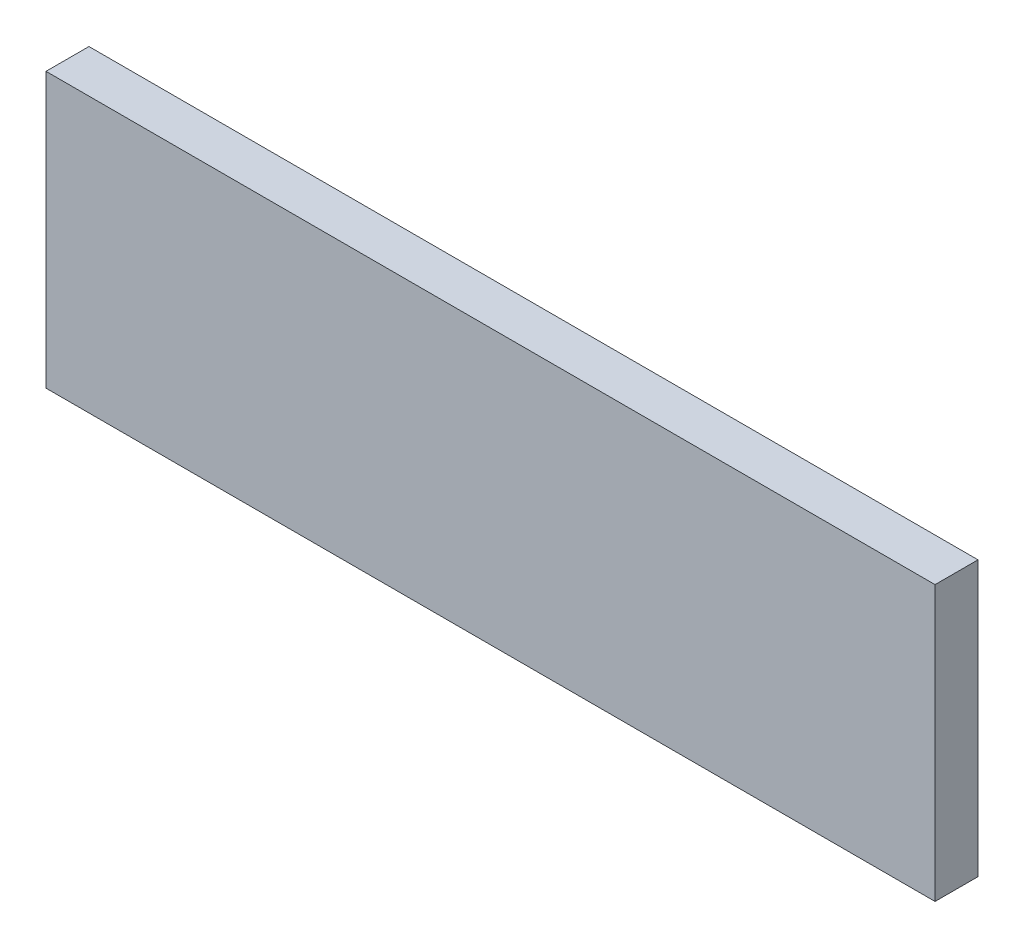
ISO-10303-21;
HEADER;
FILE_DESCRIPTION(('STEP AP214'),'2;1');
FILE_NAME('part.step','',(''),(''),'','','');
FILE_SCHEMA(('AUTOMOTIVE_DESIGN { 1 0 10303 214 1 1 1 1 }'));
ENDSEC;
DATA;
#1=APPLICATION_CONTEXT('core data for automotive mechanical design processes');
#2=APPLICATION_PROTOCOL_DEFINITION('international standard','automotive_design',2000,#1);
#3=PRODUCT_CONTEXT('',#1,'mechanical');
#4=PRODUCT('Part','Part','',(#3));
#5=PRODUCT_RELATED_PRODUCT_CATEGORY('part','',(#4));
#6=PRODUCT_DEFINITION_FORMATION('','',#4);
#7=PRODUCT_DEFINITION_CONTEXT('part definition',#1,'design');
#8=PRODUCT_DEFINITION('design','',#6,#7);
#9=PRODUCT_DEFINITION_SHAPE('','',#8);
#10=(LENGTH_UNIT() NAMED_UNIT(*) SI_UNIT(.MILLI.,.METRE.));
#11=(NAMED_UNIT(*) PLANE_ANGLE_UNIT() SI_UNIT($,.RADIAN.));
#12=(NAMED_UNIT(*) SI_UNIT($,.STERADIAN.) SOLID_ANGLE_UNIT());
#13=UNCERTAINTY_MEASURE_WITH_UNIT(LENGTH_MEASURE(1.E-05),#10,'distance_accuracy_value','');
#14=(GEOMETRIC_REPRESENTATION_CONTEXT(3) GLOBAL_UNCERTAINTY_ASSIGNED_CONTEXT((#13)) GLOBAL_UNIT_ASSIGNED_CONTEXT((#10,
#11,#12)) REPRESENTATION_CONTEXT('',''));
#15=CARTESIAN_POINT('',(0.,0.,0.));
#16=DIRECTION('',(0.,0.,1.));
#17=DIRECTION('',(1.,0.,0.));
#18=AXIS2_PLACEMENT_3D('',#15,#16,#17);
#19=CARTESIAN_POINT('',(287.58,-57.5,18.));
#20=DIRECTION('',(-1.,0.,0.));
#21=DIRECTION('',(0.,0.,1.));
#22=AXIS2_PLACEMENT_3D('',#19,#20,#21);
#23=PLANE('',#22);
#24=DIRECTION('',(0.,1.,0.));
#25=VECTOR('',#24,1.);
#26=CARTESIAN_POINT('',(287.58,-57.5,0.));
#27=LINE('',#26,#25);
#28=CARTESIAN_POINT('',(287.58,-57.5,0.));
#29=VERTEX_POINT('',#28);
#30=CARTESIAN_POINT('',(287.58,57.5,0.));
#31=VERTEX_POINT('',#30);
#32=EDGE_CURVE('E107',#29,#31,#27,.T.);
#33=ORIENTED_EDGE('',*,*,#32,.T.);
#34=DIRECTION('',(0.,0.,-1.));
#35=VECTOR('',#34,1.);
#36=CARTESIAN_POINT('',(287.58,57.5,18.));
#37=LINE('',#36,#35);
#38=CARTESIAN_POINT('',(287.58,57.5,18.));
#39=VERTEX_POINT('',#38);
#40=EDGE_CURVE('E11',#39,#31,#37,.T.);
#41=ORIENTED_EDGE('',*,*,#40,.F.);
#42=DIRECTION('',(0.,1.,0.));
#43=VECTOR('',#42,1.);
#44=CARTESIAN_POINT('',(287.58,-57.5,18.));
#45=LINE('',#44,#43);
#46=CARTESIAN_POINT('',(287.58,-57.5,18.));
#47=VERTEX_POINT('',#46);
#48=EDGE_CURVE('E91',#47,#39,#45,.T.);
#49=ORIENTED_EDGE('',*,*,#48,.F.);
#50=DIRECTION('',(0.,0.,-1.));
#51=VECTOR('',#50,1.);
#52=CARTESIAN_POINT('',(287.58,-57.5,18.));
#53=LINE('',#52,#51);
#54=EDGE_CURVE('E103',#47,#29,#53,.T.);
#55=ORIENTED_EDGE('',*,*,#54,.T.);
#56=EDGE_LOOP('',(#33,#41,#49,#55));
#57=FACE_BOUND('',#56,.T.);
#58=ADVANCED_FACE('F39',(#57),#23,.F.);
#59=CARTESIAN_POINT('',(-85.,57.5,18.));
#60=DIRECTION('',(0.,-1.,0.));
#61=DIRECTION('',(0.,0.,-1.));
#62=AXIS2_PLACEMENT_3D('',#59,#60,#61);
#63=PLANE('',#62);
#64=DIRECTION('',(-1.,0.,0.));
#65=VECTOR('',#64,1.);
#66=CARTESIAN_POINT('',(-85.,57.5,0.));
#67=LINE('',#66,#65);
#68=CARTESIAN_POINT('',(-85.,57.5,0.));
#69=VERTEX_POINT('',#68);
#70=EDGE_CURVE('E96',#31,#69,#67,.T.);
#71=ORIENTED_EDGE('',*,*,#70,.T.);
#72=DIRECTION('',(0.,0.,-1.));
#73=VECTOR('',#72,1.);
#74=CARTESIAN_POINT('',(-85.,57.5,18.));
#75=LINE('',#74,#73);
#76=CARTESIAN_POINT('',(-85.,57.5,18.));
#77=VERTEX_POINT('',#76);
#78=EDGE_CURVE('E48',#77,#69,#75,.T.);
#79=ORIENTED_EDGE('',*,*,#78,.F.);
#80=DIRECTION('',(-1.,0.,0.));
#81=VECTOR('',#80,1.);
#82=CARTESIAN_POINT('',(-85.,57.5,18.));
#83=LINE('',#82,#81);
#84=EDGE_CURVE('E86',#39,#77,#83,.T.);
#85=ORIENTED_EDGE('',*,*,#84,.F.);
#86=ORIENTED_EDGE('',*,*,#40,.T.);
#87=EDGE_LOOP('',(#71,#79,#85,#86));
#88=FACE_BOUND('',#87,.T.);
#89=ADVANCED_FACE('F95',(#88),#63,.F.);
#90=CARTESIAN_POINT('',(-85.,-57.5,18.));
#91=DIRECTION('',(1.,0.,0.));
#92=DIRECTION('',(0.,0.,-1.));
#93=AXIS2_PLACEMENT_3D('',#90,#91,#92);
#94=PLANE('',#93);
#95=DIRECTION('',(0.,-1.,0.));
#96=VECTOR('',#95,1.);
#97=CARTESIAN_POINT('',(-85.,-57.5,0.));
#98=LINE('',#97,#96);
#99=CARTESIAN_POINT('',(-85.,-57.5,0.));
#100=VERTEX_POINT('',#99);
#101=EDGE_CURVE('E73',#69,#100,#98,.T.);
#102=ORIENTED_EDGE('',*,*,#101,.T.);
#103=DIRECTION('',(0.,0.,-1.));
#104=VECTOR('',#103,1.);
#105=CARTESIAN_POINT('',(-85.,-57.5,18.));
#106=LINE('',#105,#104);
#107=CARTESIAN_POINT('',(-85.,-57.5,18.));
#108=VERTEX_POINT('',#107);
#109=EDGE_CURVE('E98',#108,#100,#106,.T.);
#110=ORIENTED_EDGE('',*,*,#109,.F.);
#111=DIRECTION('',(0.,-1.,0.));
#112=VECTOR('',#111,1.);
#113=CARTESIAN_POINT('',(-85.,-57.5,18.));
#114=LINE('',#113,#112);
#115=EDGE_CURVE('E89',#77,#108,#114,.T.);
#116=ORIENTED_EDGE('',*,*,#115,.F.);
#117=ORIENTED_EDGE('',*,*,#78,.T.);
#118=EDGE_LOOP('',(#102,#110,#116,#117));
#119=FACE_BOUND('',#118,.T.);
#120=ADVANCED_FACE('F99',(#119),#94,.F.);
#121=CARTESIAN_POINT('',(-85.,-57.5,18.));
#122=DIRECTION('',(0.,1.,0.));
#123=DIRECTION('',(0.,0.,1.));
#124=AXIS2_PLACEMENT_3D('',#121,#122,#123);
#125=PLANE('',#124);
#126=DIRECTION('',(1.,0.,0.));
#127=VECTOR('',#126,1.);
#128=CARTESIAN_POINT('',(-85.,-57.5,0.));
#129=LINE('',#128,#127);
#130=EDGE_CURVE('E79',#100,#29,#129,.T.);
#131=ORIENTED_EDGE('',*,*,#130,.T.);
#132=ORIENTED_EDGE('',*,*,#54,.F.);
#133=DIRECTION('',(1.,0.,0.));
#134=VECTOR('',#133,1.);
#135=CARTESIAN_POINT('',(-85.,-57.5,18.));
#136=LINE('',#135,#134);
#137=EDGE_CURVE('E56',#108,#47,#136,.T.);
#138=ORIENTED_EDGE('',*,*,#137,.F.);
#139=ORIENTED_EDGE('',*,*,#109,.T.);
#140=EDGE_LOOP('',(#131,#132,#138,#139));
#141=FACE_BOUND('',#140,.T.);
#142=ADVANCED_FACE('F120',(#141),#125,.F.);
#143=CARTESIAN_POINT('',(0.,0.,18.));
#144=DIRECTION('',(0.,0.,-1.));
#145=DIRECTION('',(-1.,0.,0.));
#146=AXIS2_PLACEMENT_3D('',#143,#144,#145);
#147=PLANE('',#146);
#148=ORIENTED_EDGE('',*,*,#48,.T.);
#149=ORIENTED_EDGE('',*,*,#84,.T.);
#150=ORIENTED_EDGE('',*,*,#115,.T.);
#151=ORIENTED_EDGE('',*,*,#137,.T.);
#152=EDGE_LOOP('',(#148,#149,#150,#151));
#153=FACE_BOUND('',#152,.T.);
#154=ADVANCED_FACE('F87',(#153),#147,.F.);
#155=CARTESIAN_POINT('',(0.,0.,0.));
#156=DIRECTION('',(0.,0.,-1.));
#157=DIRECTION('',(-1.,0.,0.));
#158=AXIS2_PLACEMENT_3D('',#155,#156,#157);
#159=PLANE('',#158);
#160=ORIENTED_EDGE('',*,*,#32,.F.);
#161=ORIENTED_EDGE('',*,*,#130,.F.);
#162=ORIENTED_EDGE('',*,*,#101,.F.);
#163=ORIENTED_EDGE('',*,*,#70,.F.);
#164=EDGE_LOOP('',(#160,#161,#162,#163));
#165=FACE_BOUND('',#164,.T.);
#166=ADVANCED_FACE('F123',(#165),#159,.T.);
#167=CLOSED_SHELL('',(#58,#89,#120,#142,#154,#166));
#168=MANIFOLD_SOLID_BREP('B2',#167);
#169=ADVANCED_BREP_SHAPE_REPRESENTATION('',(#18,#168),#14);
#170=SHAPE_DEFINITION_REPRESENTATION(#9,#169);
ENDSEC;
END-ISO-10303-21;
